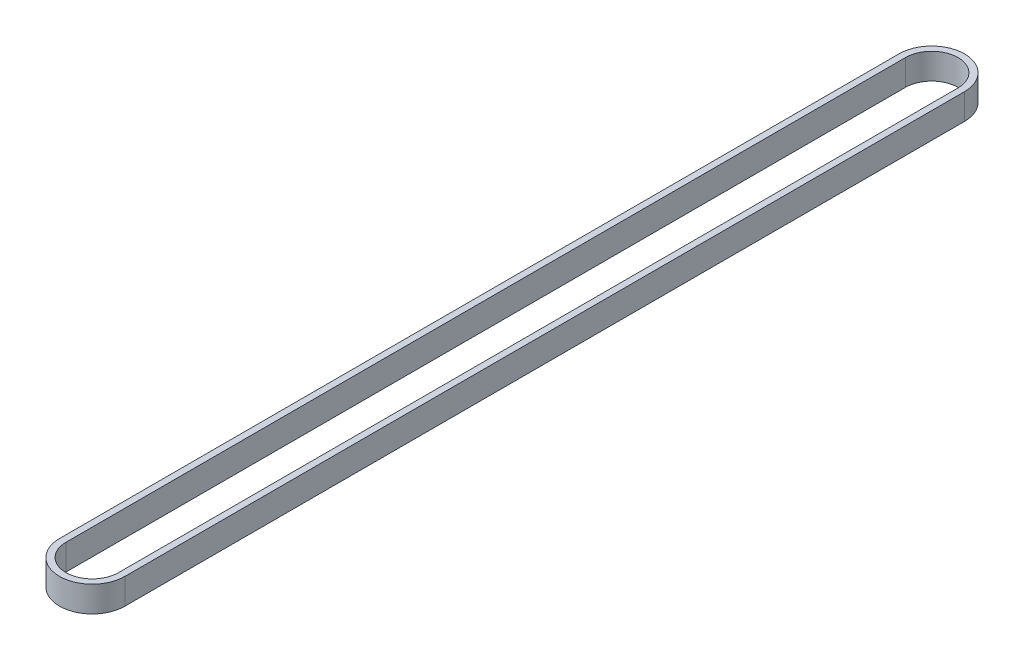
ISO-10303-21;
HEADER;
FILE_DESCRIPTION(('STEP AP214'),'2;1');
FILE_NAME('part.step','',(''),(''),'','','');
FILE_SCHEMA(('AUTOMOTIVE_DESIGN { 1 0 10303 214 1 1 1 1 }'));
ENDSEC;
DATA;
#1=APPLICATION_CONTEXT('core data for automotive mechanical design processes');
#2=APPLICATION_PROTOCOL_DEFINITION('international standard','automotive_design',2000,#1);
#3=PRODUCT_CONTEXT('',#1,'mechanical');
#4=PRODUCT('Part','Part','',(#3));
#5=PRODUCT_RELATED_PRODUCT_CATEGORY('part','',(#4));
#6=PRODUCT_DEFINITION_FORMATION('','',#4);
#7=PRODUCT_DEFINITION_CONTEXT('part definition',#1,'design');
#8=PRODUCT_DEFINITION('design','',#6,#7);
#9=PRODUCT_DEFINITION_SHAPE('','',#8);
#10=(LENGTH_UNIT() NAMED_UNIT(*) SI_UNIT(.MILLI.,.METRE.));
#11=(NAMED_UNIT(*) PLANE_ANGLE_UNIT() SI_UNIT($,.RADIAN.));
#12=(NAMED_UNIT(*) SI_UNIT($,.STERADIAN.) SOLID_ANGLE_UNIT());
#13=UNCERTAINTY_MEASURE_WITH_UNIT(LENGTH_MEASURE(1.E-05),#10,'distance_accuracy_value','');
#14=(GEOMETRIC_REPRESENTATION_CONTEXT(3) GLOBAL_UNCERTAINTY_ASSIGNED_CONTEXT((#13)) GLOBAL_UNIT_ASSIGNED_CONTEXT((#10,
#11,#12)) REPRESENTATION_CONTEXT('',''));
#15=CARTESIAN_POINT('',(0.,0.,0.));
#16=DIRECTION('',(0.,0.,1.));
#17=DIRECTION('',(1.,0.,0.));
#18=AXIS2_PLACEMENT_3D('',#15,#16,#17);
#19=CARTESIAN_POINT('',(0.,6.,97.55));
#20=DIRECTION('',(0.,1.,0.));
#21=DIRECTION('',(0.,0.,1.));
#22=AXIS2_PLACEMENT_3D('',#19,#20,#21);
#23=PLANE('',#22);
#24=CARTESIAN_POINT('',(0.,6.,97.55));
#25=DIRECTION('',(0.,1.,0.));
#26=DIRECTION('',(0.,0.,1.));
#27=AXIS2_PLACEMENT_3D('',#24,#25,#26);
#28=CIRCLE('',#27,7.61000000000003);
#29=CARTESIAN_POINT('',(-7.61000000000003,6.,97.55));
#30=VERTEX_POINT('',#29);
#31=CARTESIAN_POINT('',(7.61000000000003,6.,97.55));
#32=VERTEX_POINT('',#31);
#33=EDGE_CURVE('E156',#30,#32,#28,.T.);
#34=ORIENTED_EDGE('',*,*,#33,.T.);
#35=DIRECTION('',(0.,0.,-1.));
#36=VECTOR('',#35,1.);
#37=CARTESIAN_POINT('',(7.61000000000003,6.,97.55));
#38=LINE('',#37,#36);
#39=CARTESIAN_POINT('',(7.61,6.,-97.55));
#40=VERTEX_POINT('',#39);
#41=EDGE_CURVE('E160',#32,#40,#38,.T.);
#42=ORIENTED_EDGE('',*,*,#41,.T.);
#43=CARTESIAN_POINT('',(0.,6.,-97.55));
#44=DIRECTION('',(0.,1.,0.));
#45=DIRECTION('',(0.,0.,1.));
#46=AXIS2_PLACEMENT_3D('',#43,#44,#45);
#47=CIRCLE('',#46,7.61000000000003);
#48=CARTESIAN_POINT('',(-7.61000000000005,6.,-97.55));
#49=VERTEX_POINT('',#48);
#50=EDGE_CURVE('E164',#40,#49,#47,.T.);
#51=ORIENTED_EDGE('',*,*,#50,.T.);
#52=DIRECTION('',(0.,0.,1.));
#53=VECTOR('',#52,1.);
#54=CARTESIAN_POINT('',(-7.61000000000003,6.,97.55));
#55=LINE('',#54,#53);
#56=EDGE_CURVE('E167',#49,#30,#55,.T.);
#57=ORIENTED_EDGE('',*,*,#56,.T.);
#58=EDGE_LOOP('',(#34,#42,#51,#57));
#59=FACE_BOUND('',#58,.T.);
#60=DIRECTION('',(0.,0.,-1.));
#61=VECTOR('',#60,1.);
#62=CARTESIAN_POINT('',(6.10999999999998,6.,97.55));
#63=LINE('',#62,#61);
#64=CARTESIAN_POINT('',(6.10999999999998,6.,97.55));
#65=VERTEX_POINT('',#64);
#66=CARTESIAN_POINT('',(6.10999999999998,6.,-97.55));
#67=VERTEX_POINT('',#66);
#68=EDGE_CURVE('E117',#65,#67,#63,.T.);
#69=ORIENTED_EDGE('',*,*,#68,.F.);
#70=CARTESIAN_POINT('',(0.,6.,97.55));
#71=DIRECTION('',(0.,1.,0.));
#72=DIRECTION('',(0.,0.,1.));
#73=AXIS2_PLACEMENT_3D('',#70,#71,#72);
#74=CIRCLE('',#73,6.11);
#75=CARTESIAN_POINT('',(-6.11000000000002,6.,97.55));
#76=VERTEX_POINT('',#75);
#77=EDGE_CURVE('E108',#76,#65,#74,.T.);
#78=ORIENTED_EDGE('',*,*,#77,.F.);
#79=DIRECTION('',(0.,0.,1.));
#80=VECTOR('',#79,1.);
#81=CARTESIAN_POINT('',(-6.11000000000002,6.,97.55));
#82=LINE('',#81,#80);
#83=CARTESIAN_POINT('',(-6.11000000000002,6.,-97.55));
#84=VERTEX_POINT('',#83);
#85=EDGE_CURVE('E134',#84,#76,#82,.T.);
#86=ORIENTED_EDGE('',*,*,#85,.F.);
#87=CARTESIAN_POINT('',(0.,6.,-97.55));
#88=DIRECTION('',(0.,1.,0.));
#89=DIRECTION('',(0.,0.,1.));
#90=AXIS2_PLACEMENT_3D('',#87,#88,#89);
#91=CIRCLE('',#90,6.11);
#92=EDGE_CURVE('E130',#67,#84,#91,.T.);
#93=ORIENTED_EDGE('',*,*,#92,.F.);
#94=EDGE_LOOP('',(#69,#78,#86,#93));
#95=FACE_BOUND('',#94,.T.);
#96=ADVANCED_FACE('F42',(#59,#95),#23,.T.);
#97=CARTESIAN_POINT('',(0.,0.,97.55));
#98=DIRECTION('',(0.,1.,0.));
#99=DIRECTION('',(0.,0.,1.));
#100=AXIS2_PLACEMENT_3D('',#97,#98,#99);
#101=PLANE('',#100);
#102=CARTESIAN_POINT('',(0.,0.,97.55));
#103=DIRECTION('',(0.,1.,0.));
#104=DIRECTION('',(0.,0.,1.));
#105=AXIS2_PLACEMENT_3D('',#102,#103,#104);
#106=CIRCLE('',#105,7.61000000000003);
#107=CARTESIAN_POINT('',(-7.61000000000003,0.,97.55));
#108=VERTEX_POINT('',#107);
#109=CARTESIAN_POINT('',(7.61000000000003,0.,97.55));
#110=VERTEX_POINT('',#109);
#111=EDGE_CURVE('E126',#108,#110,#106,.T.);
#112=ORIENTED_EDGE('',*,*,#111,.F.);
#113=DIRECTION('',(0.,0.,1.));
#114=VECTOR('',#113,1.);
#115=CARTESIAN_POINT('',(-7.61000000000003,0.,97.55));
#116=LINE('',#115,#114);
#117=CARTESIAN_POINT('',(-7.61000000000005,0.,-97.55));
#118=VERTEX_POINT('',#117);
#119=EDGE_CURVE('E161',#118,#108,#116,.T.);
#120=ORIENTED_EDGE('',*,*,#119,.F.);
#121=CARTESIAN_POINT('',(0.,0.,-97.55));
#122=DIRECTION('',(0.,1.,0.));
#123=DIRECTION('',(0.,0.,1.));
#124=AXIS2_PLACEMENT_3D('',#121,#122,#123);
#125=CIRCLE('',#124,7.61000000000003);
#126=CARTESIAN_POINT('',(7.61,0.,-97.55));
#127=VERTEX_POINT('',#126);
#128=EDGE_CURVE('E177',#127,#118,#125,.T.);
#129=ORIENTED_EDGE('',*,*,#128,.F.);
#130=DIRECTION('',(0.,0.,-1.));
#131=VECTOR('',#130,1.);
#132=CARTESIAN_POINT('',(7.61000000000003,0.,97.55));
#133=LINE('',#132,#131);
#134=EDGE_CURVE('E174',#110,#127,#133,.T.);
#135=ORIENTED_EDGE('',*,*,#134,.F.);
#136=EDGE_LOOP('',(#112,#120,#129,#135));
#137=FACE_BOUND('',#136,.T.);
#138=CARTESIAN_POINT('',(0.,0.,97.55));
#139=DIRECTION('',(0.,1.,0.));
#140=DIRECTION('',(0.,0.,1.));
#141=AXIS2_PLACEMENT_3D('',#138,#139,#140);
#142=CIRCLE('',#141,6.11);
#143=CARTESIAN_POINT('',(-6.11000000000002,0.,97.55));
#144=VERTEX_POINT('',#143);
#145=CARTESIAN_POINT('',(6.10999999999998,0.,97.55));
#146=VERTEX_POINT('',#145);
#147=EDGE_CURVE('E66',#144,#146,#142,.T.);
#148=ORIENTED_EDGE('',*,*,#147,.T.);
#149=DIRECTION('',(0.,0.,-1.));
#150=VECTOR('',#149,1.);
#151=CARTESIAN_POINT('',(6.10999999999998,0.,97.55));
#152=LINE('',#151,#150);
#153=CARTESIAN_POINT('',(6.10999999999998,0.,-97.55));
#154=VERTEX_POINT('',#153);
#155=EDGE_CURVE('E124',#146,#154,#152,.T.);
#156=ORIENTED_EDGE('',*,*,#155,.T.);
#157=CARTESIAN_POINT('',(0.,0.,-97.55));
#158=DIRECTION('',(0.,1.,0.));
#159=DIRECTION('',(0.,0.,1.));
#160=AXIS2_PLACEMENT_3D('',#157,#158,#159);
#161=CIRCLE('',#160,6.11);
#162=CARTESIAN_POINT('',(-6.11000000000002,0.,-97.55));
#163=VERTEX_POINT('',#162);
#164=EDGE_CURVE('E143',#154,#163,#161,.T.);
#165=ORIENTED_EDGE('',*,*,#164,.T.);
#166=DIRECTION('',(0.,0.,1.));
#167=VECTOR('',#166,1.);
#168=CARTESIAN_POINT('',(-6.11000000000002,0.,97.55));
#169=LINE('',#168,#167);
#170=EDGE_CURVE('E118',#163,#144,#169,.T.);
#171=ORIENTED_EDGE('',*,*,#170,.T.);
#172=EDGE_LOOP('',(#148,#156,#165,#171));
#173=FACE_BOUND('',#172,.T.);
#174=ADVANCED_FACE('F200',(#137,#173),#101,.F.);
#175=CARTESIAN_POINT('',(0.,6.,97.55));
#176=DIRECTION('',(0.,-1.,0.));
#177=DIRECTION('',(0.,0.,-1.));
#178=AXIS2_PLACEMENT_3D('',#175,#176,#177);
#179=CYLINDRICAL_SURFACE('',#178,7.61000000000003);
#180=ORIENTED_EDGE('',*,*,#111,.T.);
#181=DIRECTION('',(0.,-1.,0.));
#182=VECTOR('',#181,1.);
#183=CARTESIAN_POINT('',(7.61000000000003,6.,97.55));
#184=LINE('',#183,#182);
#185=EDGE_CURVE('E11',#32,#110,#184,.T.);
#186=ORIENTED_EDGE('',*,*,#185,.F.);
#187=ORIENTED_EDGE('',*,*,#33,.F.);
#188=DIRECTION('',(0.,-1.,0.));
#189=VECTOR('',#188,1.);
#190=CARTESIAN_POINT('',(-7.61000000000003,6.,97.55));
#191=LINE('',#190,#189);
#192=EDGE_CURVE('E170',#30,#108,#191,.T.);
#193=ORIENTED_EDGE('',*,*,#192,.T.);
#194=EDGE_LOOP('',(#180,#186,#187,#193));
#195=FACE_BOUND('',#194,.T.);
#196=ADVANCED_FACE('F44',(#195),#179,.T.);
#197=CARTESIAN_POINT('',(7.61000000000003,6.,97.55));
#198=DIRECTION('',(-1.,0.,0.));
#199=DIRECTION('',(0.,0.,1.));
#200=AXIS2_PLACEMENT_3D('',#197,#198,#199);
#201=PLANE('',#200);
#202=ORIENTED_EDGE('',*,*,#134,.T.);
#203=DIRECTION('',(0.,-1.,0.));
#204=VECTOR('',#203,1.);
#205=CARTESIAN_POINT('',(7.61,6.,-97.55));
#206=LINE('',#205,#204);
#207=EDGE_CURVE('E51',#40,#127,#206,.T.);
#208=ORIENTED_EDGE('',*,*,#207,.F.);
#209=ORIENTED_EDGE('',*,*,#41,.F.);
#210=ORIENTED_EDGE('',*,*,#185,.T.);
#211=EDGE_LOOP('',(#202,#208,#209,#210));
#212=FACE_BOUND('',#211,.T.);
#213=ADVANCED_FACE('F210',(#212),#201,.F.);
#214=CARTESIAN_POINT('',(0.,6.,-97.55));
#215=DIRECTION('',(0.,-1.,0.));
#216=DIRECTION('',(0.,0.,-1.));
#217=AXIS2_PLACEMENT_3D('',#214,#215,#216);
#218=CYLINDRICAL_SURFACE('',#217,7.61000000000003);
#219=ORIENTED_EDGE('',*,*,#128,.T.);
#220=DIRECTION('',(0.,-1.,0.));
#221=VECTOR('',#220,1.);
#222=CARTESIAN_POINT('',(-7.61000000000005,6.,-97.55));
#223=LINE('',#222,#221);
#224=EDGE_CURVE('E185',#49,#118,#223,.T.);
#225=ORIENTED_EDGE('',*,*,#224,.F.);
#226=ORIENTED_EDGE('',*,*,#50,.F.);
#227=ORIENTED_EDGE('',*,*,#207,.T.);
#228=EDGE_LOOP('',(#219,#225,#226,#227));
#229=FACE_BOUND('',#228,.T.);
#230=ADVANCED_FACE('F194',(#229),#218,.T.);
#231=CARTESIAN_POINT('',(-7.61000000000003,6.,97.55));
#232=DIRECTION('',(1.,0.,0.));
#233=DIRECTION('',(0.,0.,-1.));
#234=AXIS2_PLACEMENT_3D('',#231,#232,#233);
#235=PLANE('',#234);
#236=ORIENTED_EDGE('',*,*,#119,.T.);
#237=ORIENTED_EDGE('',*,*,#192,.F.);
#238=ORIENTED_EDGE('',*,*,#56,.F.);
#239=ORIENTED_EDGE('',*,*,#224,.T.);
#240=EDGE_LOOP('',(#236,#237,#238,#239));
#241=FACE_BOUND('',#240,.T.);
#242=ADVANCED_FACE('F204',(#241),#235,.F.);
#243=CARTESIAN_POINT('',(0.,6.,97.55));
#244=DIRECTION('',(0.,-1.,0.));
#245=DIRECTION('',(0.,0.,-1.));
#246=AXIS2_PLACEMENT_3D('',#243,#244,#245);
#247=CYLINDRICAL_SURFACE('',#246,6.11);
#248=ORIENTED_EDGE('',*,*,#147,.F.);
#249=DIRECTION('',(0.,-1.,0.));
#250=VECTOR('',#249,1.);
#251=CARTESIAN_POINT('',(-6.11000000000002,6.,97.55));
#252=LINE('',#251,#250);
#253=EDGE_CURVE('E112',#76,#144,#252,.T.);
#254=ORIENTED_EDGE('',*,*,#253,.F.);
#255=ORIENTED_EDGE('',*,*,#77,.T.);
#256=DIRECTION('',(0.,-1.,0.));
#257=VECTOR('',#256,1.);
#258=CARTESIAN_POINT('',(6.10999999999998,6.,97.55));
#259=LINE('',#258,#257);
#260=EDGE_CURVE('E111',#65,#146,#259,.T.);
#261=ORIENTED_EDGE('',*,*,#260,.T.);
#262=EDGE_LOOP('',(#248,#254,#255,#261));
#263=FACE_BOUND('',#262,.T.);
#264=ADVANCED_FACE('F110',(#263),#247,.F.);
#265=CARTESIAN_POINT('',(6.10999999999998,6.,97.55));
#266=DIRECTION('',(-1.,0.,0.));
#267=DIRECTION('',(0.,0.,1.));
#268=AXIS2_PLACEMENT_3D('',#265,#266,#267);
#269=PLANE('',#268);
#270=ORIENTED_EDGE('',*,*,#155,.F.);
#271=ORIENTED_EDGE('',*,*,#260,.F.);
#272=ORIENTED_EDGE('',*,*,#68,.T.);
#273=DIRECTION('',(0.,-1.,0.));
#274=VECTOR('',#273,1.);
#275=CARTESIAN_POINT('',(6.10999999999998,6.,-97.55));
#276=LINE('',#275,#274);
#277=EDGE_CURVE('E127',#67,#154,#276,.T.);
#278=ORIENTED_EDGE('',*,*,#277,.T.);
#279=EDGE_LOOP('',(#270,#271,#272,#278));
#280=FACE_BOUND('',#279,.T.);
#281=ADVANCED_FACE('F121',(#280),#269,.T.);
#282=CARTESIAN_POINT('',(0.,6.,-97.55));
#283=DIRECTION('',(0.,-1.,0.));
#284=DIRECTION('',(0.,0.,-1.));
#285=AXIS2_PLACEMENT_3D('',#282,#283,#284);
#286=CYLINDRICAL_SURFACE('',#285,6.11);
#287=ORIENTED_EDGE('',*,*,#164,.F.);
#288=ORIENTED_EDGE('',*,*,#277,.F.);
#289=ORIENTED_EDGE('',*,*,#92,.T.);
#290=DIRECTION('',(0.,-1.,0.));
#291=VECTOR('',#290,1.);
#292=CARTESIAN_POINT('',(-6.11000000000002,6.,-97.55));
#293=LINE('',#292,#291);
#294=EDGE_CURVE('E58',#84,#163,#293,.T.);
#295=ORIENTED_EDGE('',*,*,#294,.T.);
#296=EDGE_LOOP('',(#287,#288,#289,#295));
#297=FACE_BOUND('',#296,.T.);
#298=ADVANCED_FACE('F233',(#297),#286,.F.);
#299=CARTESIAN_POINT('',(-6.11000000000002,6.,97.55));
#300=DIRECTION('',(1.,0.,0.));
#301=DIRECTION('',(0.,0.,-1.));
#302=AXIS2_PLACEMENT_3D('',#299,#300,#301);
#303=PLANE('',#302);
#304=ORIENTED_EDGE('',*,*,#170,.F.);
#305=ORIENTED_EDGE('',*,*,#294,.F.);
#306=ORIENTED_EDGE('',*,*,#85,.T.);
#307=ORIENTED_EDGE('',*,*,#253,.T.);
#308=EDGE_LOOP('',(#304,#305,#306,#307));
#309=FACE_BOUND('',#308,.T.);
#310=ADVANCED_FACE('F237',(#309),#303,.T.);
#311=CLOSED_SHELL('',(#96,#174,#196,#213,#230,#242,#264,#281,#298,#310));
#312=MANIFOLD_SOLID_BREP('B2',#311);
#313=ADVANCED_BREP_SHAPE_REPRESENTATION('',(#18,#312),#14);
#314=SHAPE_DEFINITION_REPRESENTATION(#9,#313);
ENDSEC;
END-ISO-10303-21;
